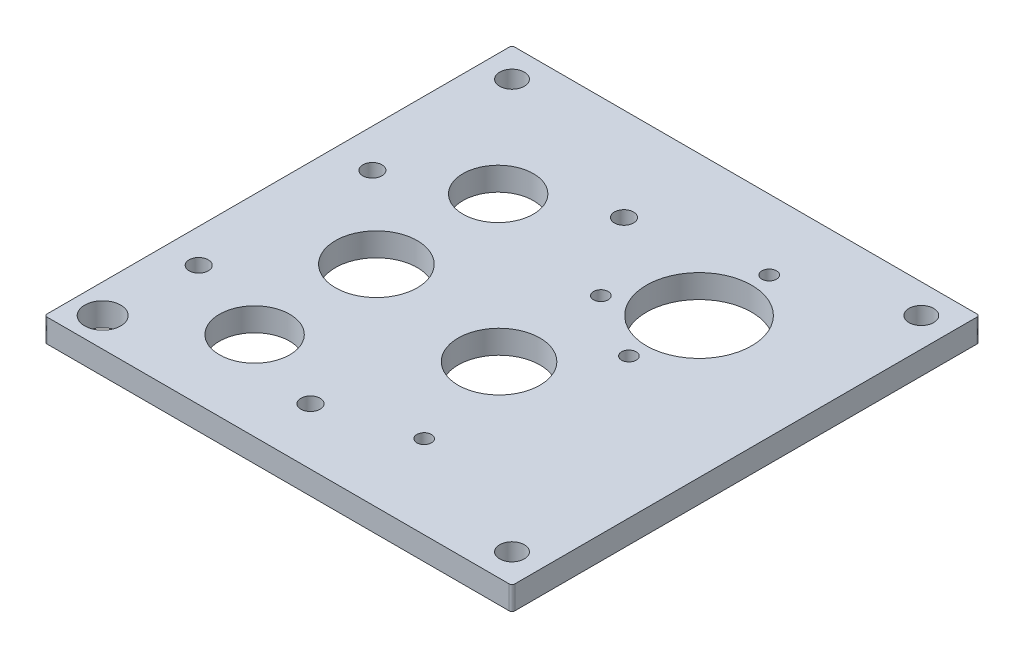
ISO-10303-21;
HEADER;
FILE_DESCRIPTION(('STEP AP214'),'2;1');
FILE_NAME('part.step','',(''),(''),'','','');
FILE_SCHEMA(('AUTOMOTIVE_DESIGN { 1 0 10303 214 1 1 1 1 }'));
ENDSEC;
DATA;
#1=APPLICATION_CONTEXT('core data for automotive mechanical design processes');
#2=APPLICATION_PROTOCOL_DEFINITION('international standard','automotive_design',2000,#1);
#3=PRODUCT_CONTEXT('',#1,'mechanical');
#4=PRODUCT('Part','Part','',(#3));
#5=PRODUCT_RELATED_PRODUCT_CATEGORY('part','',(#4));
#6=PRODUCT_DEFINITION_FORMATION('','',#4);
#7=PRODUCT_DEFINITION_CONTEXT('part definition',#1,'design');
#8=PRODUCT_DEFINITION('design','',#6,#7);
#9=PRODUCT_DEFINITION_SHAPE('','',#8);
#10=(LENGTH_UNIT() NAMED_UNIT(*) SI_UNIT(.MILLI.,.METRE.));
#11=(NAMED_UNIT(*) PLANE_ANGLE_UNIT() SI_UNIT($,.RADIAN.));
#12=(NAMED_UNIT(*) SI_UNIT($,.STERADIAN.) SOLID_ANGLE_UNIT());
#13=UNCERTAINTY_MEASURE_WITH_UNIT(LENGTH_MEASURE(1.E-05),#10,'distance_accuracy_value','');
#14=(GEOMETRIC_REPRESENTATION_CONTEXT(3) GLOBAL_UNCERTAINTY_ASSIGNED_CONTEXT((#13)) GLOBAL_UNIT_ASSIGNED_CONTEXT((#10,
#11,#12)) REPRESENTATION_CONTEXT('',''));
#15=CARTESIAN_POINT('',(0.,0.,0.));
#16=DIRECTION('',(0.,0.,1.));
#17=DIRECTION('',(1.,0.,0.));
#18=AXIS2_PLACEMENT_3D('',#15,#16,#17);
#19=CARTESIAN_POINT('',(126.238,-6.35,126.238));
#20=DIRECTION('',(0.,-1.,0.));
#21=DIRECTION('',(0.,0.,-1.));
#22=AXIS2_PLACEMENT_3D('',#19,#20,#21);
#23=CYLINDRICAL_SURFACE('',#22,0.762);
#24=CARTESIAN_POINT('',(126.238,0.,126.238));
#25=DIRECTION('',(0.,-1.,0.));
#26=DIRECTION('',(0.,0.,-1.));
#27=AXIS2_PLACEMENT_3D('',#24,#25,#26);
#28=CIRCLE('',#27,0.762);
#29=CARTESIAN_POINT('',(126.238,0.,127.));
#30=VERTEX_POINT('',#29);
#31=CARTESIAN_POINT('',(127.,0.,126.238));
#32=VERTEX_POINT('',#31);
#33=EDGE_CURVE('E100',#30,#32,#28,.F.);
#34=ORIENTED_EDGE('',*,*,#33,.F.);
#35=DIRECTION('',(0.,1.,0.));
#36=VECTOR('',#35,1.);
#37=CARTESIAN_POINT('',(126.238,-6.35,127.));
#38=LINE('',#37,#36);
#39=CARTESIAN_POINT('',(126.238,-6.35,127.));
#40=VERTEX_POINT('',#39);
#41=EDGE_CURVE('E126',#40,#30,#38,.T.);
#42=ORIENTED_EDGE('',*,*,#41,.F.);
#43=CARTESIAN_POINT('',(126.238,-6.35,126.238));
#44=DIRECTION('',(0.,-1.,0.));
#45=DIRECTION('',(0.,0.,-1.));
#46=AXIS2_PLACEMENT_3D('',#43,#44,#45);
#47=CIRCLE('',#46,0.762);
#48=CARTESIAN_POINT('',(127.,-6.35,126.238));
#49=VERTEX_POINT('',#48);
#50=EDGE_CURVE('E19',#40,#49,#47,.F.);
#51=ORIENTED_EDGE('',*,*,#50,.T.);
#52=DIRECTION('',(0.,1.,0.));
#53=VECTOR('',#52,1.);
#54=CARTESIAN_POINT('',(127.,-6.35,126.238));
#55=LINE('',#54,#53);
#56=EDGE_CURVE('E110',#32,#49,#55,.F.);
#57=ORIENTED_EDGE('',*,*,#56,.F.);
#58=EDGE_LOOP('',(#34,#42,#51,#57));
#59=FACE_BOUND('',#58,.T.);
#60=ADVANCED_FACE('F16',(#59),#23,.T.);
#61=CARTESIAN_POINT('',(126.238,-6.35,0.762000000000013));
#62=DIRECTION('',(0.,-1.,0.));
#63=DIRECTION('',(0.,0.,-1.));
#64=AXIS2_PLACEMENT_3D('',#61,#62,#63);
#65=CYLINDRICAL_SURFACE('',#64,0.762);
#66=CARTESIAN_POINT('',(126.238,0.,0.762000000000013));
#67=DIRECTION('',(0.,-1.,0.));
#68=DIRECTION('',(0.,0.,-1.));
#69=AXIS2_PLACEMENT_3D('',#66,#67,#68);
#70=CIRCLE('',#69,0.762);
#71=CARTESIAN_POINT('',(127.,0.,0.762000000000013));
#72=VERTEX_POINT('',#71);
#73=CARTESIAN_POINT('',(126.238,0.,0.));
#74=VERTEX_POINT('',#73);
#75=EDGE_CURVE('E88',#72,#74,#70,.F.);
#76=ORIENTED_EDGE('',*,*,#75,.F.);
#77=DIRECTION('',(0.,1.,0.));
#78=VECTOR('',#77,1.);
#79=CARTESIAN_POINT('',(127.,-6.35,0.762000000000013));
#80=LINE('',#79,#78);
#81=CARTESIAN_POINT('',(127.,-6.35,0.762000000000013));
#82=VERTEX_POINT('',#81);
#83=EDGE_CURVE('E91',#82,#72,#80,.T.);
#84=ORIENTED_EDGE('',*,*,#83,.F.);
#85=CARTESIAN_POINT('',(126.238,-6.35,0.762000000000013));
#86=DIRECTION('',(0.,-1.,0.));
#87=DIRECTION('',(0.,0.,-1.));
#88=AXIS2_PLACEMENT_3D('',#85,#86,#87);
#89=CIRCLE('',#88,0.762);
#90=CARTESIAN_POINT('',(126.238,-6.35,0.));
#91=VERTEX_POINT('',#90);
#92=EDGE_CURVE('E234',#82,#91,#89,.F.);
#93=ORIENTED_EDGE('',*,*,#92,.T.);
#94=DIRECTION('',(0.,1.,0.));
#95=VECTOR('',#94,1.);
#96=CARTESIAN_POINT('',(126.238,-6.35,0.));
#97=LINE('',#96,#95);
#98=EDGE_CURVE('E94',#74,#91,#97,.F.);
#99=ORIENTED_EDGE('',*,*,#98,.F.);
#100=EDGE_LOOP('',(#76,#84,#93,#99));
#101=FACE_BOUND('',#100,.T.);
#102=ADVANCED_FACE('F90',(#101),#65,.T.);
#103=CARTESIAN_POINT('',(0.762000000000013,-6.35,0.762000000000007));
#104=DIRECTION('',(0.,-1.,0.));
#105=DIRECTION('',(0.,0.,-1.));
#106=AXIS2_PLACEMENT_3D('',#103,#104,#105);
#107=CYLINDRICAL_SURFACE('',#106,0.762);
#108=CARTESIAN_POINT('',(0.762000000000013,0.,0.762000000000007));
#109=DIRECTION('',(0.,-1.,0.));
#110=DIRECTION('',(0.,0.,-1.));
#111=AXIS2_PLACEMENT_3D('',#108,#109,#110);
#112=CIRCLE('',#111,0.762);
#113=CARTESIAN_POINT('',(0.762000000000013,0.,0.));
#114=VERTEX_POINT('',#113);
#115=CARTESIAN_POINT('',(0.,0.,0.762000000000007));
#116=VERTEX_POINT('',#115);
#117=EDGE_CURVE('E231',#114,#116,#112,.F.);
#118=ORIENTED_EDGE('',*,*,#117,.F.);
#119=DIRECTION('',(0.,1.,0.));
#120=VECTOR('',#119,1.);
#121=CARTESIAN_POINT('',(0.762000000000013,-6.35,0.));
#122=LINE('',#121,#120);
#123=CARTESIAN_POINT('',(0.762000000000013,-6.35,0.));
#124=VERTEX_POINT('',#123);
#125=EDGE_CURVE('E109',#124,#114,#122,.T.);
#126=ORIENTED_EDGE('',*,*,#125,.F.);
#127=CARTESIAN_POINT('',(0.762000000000013,-6.35,0.762000000000007));
#128=DIRECTION('',(0.,-1.,0.));
#129=DIRECTION('',(0.,0.,-1.));
#130=AXIS2_PLACEMENT_3D('',#127,#128,#129);
#131=CIRCLE('',#130,0.762);
#132=CARTESIAN_POINT('',(0.,-6.35,0.762000000000008));
#133=VERTEX_POINT('',#132);
#134=EDGE_CURVE('E34',#124,#133,#131,.F.);
#135=ORIENTED_EDGE('',*,*,#134,.T.);
#136=DIRECTION('',(0.,1.,0.));
#137=VECTOR('',#136,1.);
#138=CARTESIAN_POINT('',(0.,-6.35,0.762000000000007));
#139=LINE('',#138,#137);
#140=EDGE_CURVE('E247',#116,#133,#139,.F.);
#141=ORIENTED_EDGE('',*,*,#140,.F.);
#142=EDGE_LOOP('',(#118,#126,#135,#141));
#143=FACE_BOUND('',#142,.T.);
#144=ADVANCED_FACE('F261',(#143),#107,.T.);
#145=CARTESIAN_POINT('',(0.762,-6.35,126.238));
#146=DIRECTION('',(0.,-1.,0.));
#147=DIRECTION('',(0.,0.,-1.));
#148=AXIS2_PLACEMENT_3D('',#145,#146,#147);
#149=CYLINDRICAL_SURFACE('',#148,0.762);
#150=CARTESIAN_POINT('',(0.762,0.,126.238));
#151=DIRECTION('',(0.,-1.,0.));
#152=DIRECTION('',(0.,0.,-1.));
#153=AXIS2_PLACEMENT_3D('',#150,#151,#152);
#154=CIRCLE('',#153,0.762);
#155=CARTESIAN_POINT('',(0.,0.,126.238));
#156=VERTEX_POINT('',#155);
#157=CARTESIAN_POINT('',(0.762,0.,127.));
#158=VERTEX_POINT('',#157);
#159=EDGE_CURVE('E229',#156,#158,#154,.F.);
#160=ORIENTED_EDGE('',*,*,#159,.F.);
#161=DIRECTION('',(0.,1.,0.));
#162=VECTOR('',#161,1.);
#163=CARTESIAN_POINT('',(0.,-6.35,126.238));
#164=LINE('',#163,#162);
#165=CARTESIAN_POINT('',(0.,-6.35,126.238));
#166=VERTEX_POINT('',#165);
#167=EDGE_CURVE('E204',#166,#156,#164,.T.);
#168=ORIENTED_EDGE('',*,*,#167,.F.);
#169=CARTESIAN_POINT('',(0.762,-6.35,126.238));
#170=DIRECTION('',(0.,-1.,0.));
#171=DIRECTION('',(0.,0.,-1.));
#172=AXIS2_PLACEMENT_3D('',#169,#170,#171);
#173=CIRCLE('',#172,0.762);
#174=CARTESIAN_POINT('',(0.762,-6.35,127.));
#175=VERTEX_POINT('',#174);
#176=EDGE_CURVE('E58',#166,#175,#173,.F.);
#177=ORIENTED_EDGE('',*,*,#176,.T.);
#178=DIRECTION('',(0.,1.,0.));
#179=VECTOR('',#178,1.);
#180=CARTESIAN_POINT('',(0.762,-6.35,127.));
#181=LINE('',#180,#179);
#182=EDGE_CURVE('E116',#158,#175,#181,.F.);
#183=ORIENTED_EDGE('',*,*,#182,.F.);
#184=EDGE_LOOP('',(#160,#168,#177,#183));
#185=FACE_BOUND('',#184,.T.);
#186=ADVANCED_FACE('F264',(#185),#149,.T.);
#187=CARTESIAN_POINT('',(0.,0.,127.));
#188=DIRECTION('',(0.,1.,0.));
#189=DIRECTION('',(0.,0.,1.));
#190=AXIS2_PLACEMENT_3D('',#187,#188,#189);
#191=PLANE('',#190);
#192=CARTESIAN_POINT('',(7.9248,0.,119.0752));
#193=DIRECTION('',(0.,1.,0.));
#194=DIRECTION('',(0.,0.,1.));
#195=AXIS2_PLACEMENT_3D('',#192,#193,#194);
#196=CIRCLE('',#195,4.9022);
#197=CARTESIAN_POINT('',(7.9248,0.,123.9774));
#198=VERTEX_POINT('',#197);
#199=EDGE_CURVE('E177',#198,#198,#196,.F.);
#200=ORIENTED_EDGE('',*,*,#199,.T.);
#201=EDGE_LOOP('',(#200));
#202=FACE_BOUND('',#201,.T.);
#203=CARTESIAN_POINT('',(80.5379445387263,0.,104.383776272295));
#204=DIRECTION('',(0.,-1.,0.));
#205=DIRECTION('',(0.,0.,-1.));
#206=AXIS2_PLACEMENT_3D('',#203,#204,#205);
#207=CIRCLE('',#206,1.98374);
#208=CARTESIAN_POINT('',(80.5379445387263,0.,102.400036272295));
#209=VERTEX_POINT('',#208);
#210=EDGE_CURVE('E180',#209,#209,#207,.T.);
#211=ORIENTED_EDGE('',*,*,#210,.T.);
#212=EDGE_LOOP('',(#211));
#213=FACE_BOUND('',#212,.T.);
#214=CARTESIAN_POINT('',(70.8958634043455,0.,46.7649714304898));
#215=DIRECTION('',(0.,-1.,0.));
#216=DIRECTION('',(0.,0.,-1.));
#217=AXIS2_PLACEMENT_3D('',#214,#215,#216);
#218=CIRCLE('',#217,1.98374);
#219=CARTESIAN_POINT('',(70.8958634043455,0.,44.7812314304898));
#220=VERTEX_POINT('',#219);
#221=EDGE_CURVE('E183',#220,#220,#218,.T.);
#222=ORIENTED_EDGE('',*,*,#221,.T.);
#223=EDGE_LOOP('',(#222));
#224=FACE_BOUND('',#223,.T.);
#225=CARTESIAN_POINT('',(119.0752,0.,119.0752));
#226=DIRECTION('',(0.,1.,0.));
#227=DIRECTION('',(0.,0.,1.));
#228=AXIS2_PLACEMENT_3D('',#225,#226,#227);
#229=CIRCLE('',#228,3.3528);
#230=CARTESIAN_POINT('',(119.0752,0.,122.428));
#231=VERTEX_POINT('',#230);
#232=EDGE_CURVE('E186',#231,#231,#229,.F.);
#233=ORIENTED_EDGE('',*,*,#232,.T.);
#234=EDGE_LOOP('',(#233));
#235=FACE_BOUND('',#234,.T.);
#236=CARTESIAN_POINT('',(7.92480000000001,0.,7.92480000000001));
#237=DIRECTION('',(0.,1.,0.));
#238=DIRECTION('',(0.,0.,1.));
#239=AXIS2_PLACEMENT_3D('',#236,#237,#238);
#240=CIRCLE('',#239,3.3528);
#241=CARTESIAN_POINT('',(7.92480000000001,0.,11.2776));
#242=VERTEX_POINT('',#241);
#243=EDGE_CURVE('E189',#242,#242,#240,.F.);
#244=ORIENTED_EDGE('',*,*,#243,.T.);
#245=EDGE_LOOP('',(#244));
#246=FACE_BOUND('',#245,.T.);
#247=CARTESIAN_POINT('',(72.5854471866552,0.,76.0984));
#248=DIRECTION('',(0.,1.,0.));
#249=DIRECTION('',(0.,0.,1.));
#250=AXIS2_PLACEMENT_3D('',#247,#248,#249);
#251=CIRCLE('',#250,11.10615);
#252=CARTESIAN_POINT('',(72.5854471866552,0.,87.20455));
#253=VERTEX_POINT('',#252);
#254=EDGE_CURVE('E192',#253,#253,#251,.F.);
#255=ORIENTED_EDGE('',*,*,#254,.T.);
#256=EDGE_LOOP('',(#255));
#257=FACE_BOUND('',#256,.T.);
#258=CARTESIAN_POINT('',(56.8881925679621,0.,111.608111640472));
#259=DIRECTION('',(0.,1.,0.));
#260=DIRECTION('',(0.,0.,1.));
#261=AXIS2_PLACEMENT_3D('',#258,#259,#260);
#262=CIRCLE('',#261,2.6035);
#263=CARTESIAN_POINT('',(56.8881925679621,0.,114.211611640472));
#264=VERTEX_POINT('',#263);
#265=EDGE_CURVE('E195',#264,#264,#262,.F.);
#266=ORIENTED_EDGE('',*,*,#265,.T.);
#267=EDGE_LOOP('',(#266));
#268=FACE_BOUND('',#267,.T.);
#269=CARTESIAN_POINT('',(33.02,0.,102.9208));
#270=DIRECTION('',(0.,1.,0.));
#271=DIRECTION('',(0.,0.,1.));
#272=AXIS2_PLACEMENT_3D('',#269,#270,#271);
#273=CIRCLE('',#272,9.5504);
#274=CARTESIAN_POINT('',(33.02,0.,112.4712));
#275=VERTEX_POINT('',#274);
#276=EDGE_CURVE('E198',#275,#275,#273,.F.);
#277=ORIENTED_EDGE('',*,*,#276,.T.);
#278=EDGE_LOOP('',(#277));
#279=FACE_BOUND('',#278,.T.);
#280=CARTESIAN_POINT('',(10.3884342856154,0.,48.3105586933845));
#281=DIRECTION('',(0.,1.,0.));
#282=DIRECTION('',(0.,0.,1.));
#283=AXIS2_PLACEMENT_3D('',#280,#281,#282);
#284=CIRCLE('',#283,2.6035);
#285=CARTESIAN_POINT('',(10.3884342856154,0.,50.9140586933845));
#286=VERTEX_POINT('',#285);
#287=EDGE_CURVE('E201',#286,#286,#284,.F.);
#288=ORIENTED_EDGE('',*,*,#287,.T.);
#289=EDGE_LOOP('',(#288));
#290=FACE_BOUND('',#289,.T.);
#291=DIRECTION('',(0.,0.,-1.));
#292=VECTOR('',#291,1.);
#293=CARTESIAN_POINT('',(127.,0.,127.));
#294=LINE('',#293,#292);
#295=EDGE_CURVE('E106',#72,#32,#294,.F.);
#296=ORIENTED_EDGE('',*,*,#295,.F.);
#297=ORIENTED_EDGE('',*,*,#75,.T.);
#298=DIRECTION('',(-1.,0.,0.));
#299=VECTOR('',#298,1.);
#300=CARTESIAN_POINT('',(127.,0.,0.));
#301=LINE('',#300,#299);
#302=EDGE_CURVE('E123',#114,#74,#301,.F.);
#303=ORIENTED_EDGE('',*,*,#302,.F.);
#304=ORIENTED_EDGE('',*,*,#117,.T.);
#305=DIRECTION('',(0.,0.,1.));
#306=VECTOR('',#305,1.);
#307=CARTESIAN_POINT('',(0.,0.,0.));
#308=LINE('',#307,#306);
#309=EDGE_CURVE('E249',#156,#116,#308,.F.);
#310=ORIENTED_EDGE('',*,*,#309,.F.);
#311=ORIENTED_EDGE('',*,*,#159,.T.);
#312=DIRECTION('',(1.,0.,0.));
#313=VECTOR('',#312,1.);
#314=CARTESIAN_POINT('',(0.,0.,127.));
#315=LINE('',#314,#313);
#316=EDGE_CURVE('E119',#30,#158,#315,.F.);
#317=ORIENTED_EDGE('',*,*,#316,.F.);
#318=ORIENTED_EDGE('',*,*,#33,.T.);
#319=EDGE_LOOP('',(#296,#297,#303,#304,#310,#311,#317,#318));
#320=FACE_BOUND('',#319,.T.);
#321=CARTESIAN_POINT('',(33.02,0.,69.85));
#322=DIRECTION('',(0.,1.,0.));
#323=DIRECTION('',(0.,0.,1.));
#324=AXIS2_PLACEMENT_3D('',#321,#322,#323);
#325=CIRCLE('',#324,11.10615);
#326=CARTESIAN_POINT('',(33.02,0.,80.95615));
#327=VERTEX_POINT('',#326);
#328=EDGE_CURVE('E205',#327,#327,#325,.F.);
#329=ORIENTED_EDGE('',*,*,#328,.T.);
#330=EDGE_LOOP('',(#329));
#331=FACE_BOUND('',#330,.T.);
#332=CARTESIAN_POINT('',(55.6515657143845,0.,25.2478413066155));
#333=DIRECTION('',(0.,1.,0.));
#334=DIRECTION('',(0.,0.,1.));
#335=AXIS2_PLACEMENT_3D('',#332,#333,#334);
#336=CIRCLE('',#335,2.6035);
#337=CARTESIAN_POINT('',(55.6515657143845,0.,27.8513413066155));
#338=VERTEX_POINT('',#337);
#339=EDGE_CURVE('E208',#338,#338,#336,.F.);
#340=ORIENTED_EDGE('',*,*,#339,.T.);
#341=EDGE_LOOP('',(#340));
#342=FACE_BOUND('',#341,.T.);
#343=CARTESIAN_POINT('',(9.15180743203793,0.,94.233488359528));
#344=DIRECTION('',(0.,1.,0.));
#345=DIRECTION('',(0.,0.,1.));
#346=AXIS2_PLACEMENT_3D('',#343,#344,#345);
#347=CIRCLE('',#346,2.6035);
#348=CARTESIAN_POINT('',(9.15180743203793,0.,96.836988359528));
#349=VERTEX_POINT('',#348);
#350=EDGE_CURVE('E211',#349,#349,#347,.F.);
#351=ORIENTED_EDGE('',*,*,#350,.T.);
#352=EDGE_LOOP('',(#351));
#353=FACE_BOUND('',#352,.T.);
#354=CARTESIAN_POINT('',(33.02,0.,36.7792));
#355=DIRECTION('',(0.,1.,0.));
#356=DIRECTION('',(0.,0.,1.));
#357=AXIS2_PLACEMENT_3D('',#354,#355,#356);
#358=CIRCLE('',#357,9.5504);
#359=CARTESIAN_POINT('',(33.02,0.,46.3296));
#360=VERTEX_POINT('',#359);
#361=EDGE_CURVE('E214',#360,#360,#358,.F.);
#362=ORIENTED_EDGE('',*,*,#361,.T.);
#363=EDGE_LOOP('',(#362));
#364=FACE_BOUND('',#363,.T.);
#365=CARTESIAN_POINT('',(88.8962822014544,0.,38.1));
#366=DIRECTION('',(0.,1.,0.));
#367=DIRECTION('',(0.,0.,1.));
#368=AXIS2_PLACEMENT_3D('',#365,#366,#367);
#369=CIRCLE('',#368,14.28115);
#370=CARTESIAN_POINT('',(88.8962822014544,0.,52.38115));
#371=VERTEX_POINT('',#370);
#372=EDGE_CURVE('E217',#371,#371,#369,.F.);
#373=ORIENTED_EDGE('',*,*,#372,.T.);
#374=EDGE_LOOP('',(#373));
#375=FACE_BOUND('',#374,.T.);
#376=CARTESIAN_POINT('',(119.0752,0.,7.92480000000001));
#377=DIRECTION('',(0.,1.,0.));
#378=DIRECTION('',(0.,0.,1.));
#379=AXIS2_PLACEMENT_3D('',#376,#377,#378);
#380=CIRCLE('',#379,3.3528);
#381=CARTESIAN_POINT('',(119.0752,0.,11.2776));
#382=VERTEX_POINT('',#381);
#383=EDGE_CURVE('E220',#382,#382,#380,.F.);
#384=ORIENTED_EDGE('',*,*,#383,.T.);
#385=EDGE_LOOP('',(#384));
#386=FACE_BOUND('',#385,.T.);
#387=CARTESIAN_POINT('',(88.8962822014544,0.,57.15));
#388=DIRECTION('',(0.,-1.,0.));
#389=DIRECTION('',(0.,0.,-1.));
#390=AXIS2_PLACEMENT_3D('',#387,#388,#389);
#391=CIRCLE('',#390,1.98374);
#392=CARTESIAN_POINT('',(88.8962822014544,0.,55.16626));
#393=VERTEX_POINT('',#392);
#394=EDGE_CURVE('E223',#393,#393,#391,.T.);
#395=ORIENTED_EDGE('',*,*,#394,.T.);
#396=EDGE_LOOP('',(#395));
#397=FACE_BOUND('',#396,.T.);
#398=CARTESIAN_POINT('',(88.8962822014544,0.,19.05));
#399=DIRECTION('',(0.,-1.,0.));
#400=DIRECTION('',(0.,0.,-1.));
#401=AXIS2_PLACEMENT_3D('',#398,#399,#400);
#402=CIRCLE('',#401,1.98374);
#403=CARTESIAN_POINT('',(88.8962822014544,0.,17.06626));
#404=VERTEX_POINT('',#403);
#405=EDGE_CURVE('E99',#404,#404,#402,.T.);
#406=ORIENTED_EDGE('',*,*,#405,.T.);
#407=EDGE_LOOP('',(#406));
#408=FACE_BOUND('',#407,.T.);
#409=ADVANCED_FACE('F112',(#202,#213,#224,#235,#246,#257,#268,#279,#290,#320,#331,#342,#353,
#364,#375,#386,#397,#408),#191,.T.);
#410=CARTESIAN_POINT('',(88.8962822014544,-6.35,19.05));
#411=DIRECTION('',(0.,-1.,0.));
#412=DIRECTION('',(0.,0.,-1.));
#413=AXIS2_PLACEMENT_3D('',#410,#411,#412);
#414=CYLINDRICAL_SURFACE('',#413,1.98374);
#415=CARTESIAN_POINT('',(88.8962822014544,-6.35,19.05));
#416=DIRECTION('',(0.,-1.,0.));
#417=DIRECTION('',(0.,0.,-1.));
#418=AXIS2_PLACEMENT_3D('',#415,#416,#417);
#419=CIRCLE('',#418,1.98374);
#420=CARTESIAN_POINT('',(88.8962822014544,-6.35,17.06626));
#421=VERTEX_POINT('',#420);
#422=EDGE_CURVE('E174',#421,#421,#419,.T.);
#423=ORIENTED_EDGE('',*,*,#422,.T.);
#424=EDGE_LOOP('',(#423));
#425=FACE_BOUND('',#424,.T.);
#426=ORIENTED_EDGE('',*,*,#405,.F.);
#427=EDGE_LOOP('',(#426));
#428=FACE_BOUND('',#427,.T.);
#429=ADVANCED_FACE('F432',(#425,#428),#414,.F.);
#430=CARTESIAN_POINT('',(88.8962822014544,-6.35,57.15));
#431=DIRECTION('',(0.,-1.,0.));
#432=DIRECTION('',(0.,0.,-1.));
#433=AXIS2_PLACEMENT_3D('',#430,#431,#432);
#434=CYLINDRICAL_SURFACE('',#433,1.98374);
#435=CARTESIAN_POINT('',(88.8962822014544,-6.35,57.15));
#436=DIRECTION('',(0.,-1.,0.));
#437=DIRECTION('',(0.,0.,-1.));
#438=AXIS2_PLACEMENT_3D('',#435,#436,#437);
#439=CIRCLE('',#438,1.98374);
#440=CARTESIAN_POINT('',(88.8962822014544,-6.35,55.16626));
#441=VERTEX_POINT('',#440);
#442=EDGE_CURVE('E171',#441,#441,#439,.T.);
#443=ORIENTED_EDGE('',*,*,#442,.T.);
#444=EDGE_LOOP('',(#443));
#445=FACE_BOUND('',#444,.T.);
#446=ORIENTED_EDGE('',*,*,#394,.F.);
#447=EDGE_LOOP('',(#446));
#448=FACE_BOUND('',#447,.T.);
#449=ADVANCED_FACE('F424',(#445,#448),#434,.F.);
#450=CARTESIAN_POINT('',(119.0752,173.367340565678,7.92480000000001));
#451=DIRECTION('',(0.,1.,0.));
#452=DIRECTION('',(0.,0.,1.));
#453=AXIS2_PLACEMENT_3D('',#450,#451,#452);
#454=CYLINDRICAL_SURFACE('',#453,3.3528);
#455=ORIENTED_EDGE('',*,*,#383,.F.);
#456=EDGE_LOOP('',(#455));
#457=FACE_BOUND('',#456,.T.);
#458=CARTESIAN_POINT('',(119.0752,-6.34999999999999,7.92480000000001));
#459=DIRECTION('',(0.,1.,0.));
#460=DIRECTION('',(0.,0.,1.));
#461=AXIS2_PLACEMENT_3D('',#458,#459,#460);
#462=CIRCLE('',#461,3.3528);
#463=CARTESIAN_POINT('',(119.0752,-6.34999999999999,11.2776));
#464=VERTEX_POINT('',#463);
#465=EDGE_CURVE('E168',#464,#464,#462,.F.);
#466=ORIENTED_EDGE('',*,*,#465,.T.);
#467=EDGE_LOOP('',(#466));
#468=FACE_BOUND('',#467,.T.);
#469=ADVANCED_FACE('F416',(#457,#468),#454,.F.);
#470=CARTESIAN_POINT('',(88.8962822014544,173.367340565678,38.1));
#471=DIRECTION('',(0.,1.,0.));
#472=DIRECTION('',(0.,0.,1.));
#473=AXIS2_PLACEMENT_3D('',#470,#471,#472);
#474=CYLINDRICAL_SURFACE('',#473,14.28115);
#475=ORIENTED_EDGE('',*,*,#372,.F.);
#476=EDGE_LOOP('',(#475));
#477=FACE_BOUND('',#476,.T.);
#478=CARTESIAN_POINT('',(88.8962822014544,-6.34999999999999,38.1));
#479=DIRECTION('',(0.,1.,0.));
#480=DIRECTION('',(0.,0.,1.));
#481=AXIS2_PLACEMENT_3D('',#478,#479,#480);
#482=CIRCLE('',#481,14.28115);
#483=CARTESIAN_POINT('',(88.8962822014544,-6.34999999999999,52.38115));
#484=VERTEX_POINT('',#483);
#485=EDGE_CURVE('E165',#484,#484,#482,.F.);
#486=ORIENTED_EDGE('',*,*,#485,.T.);
#487=EDGE_LOOP('',(#486));
#488=FACE_BOUND('',#487,.T.);
#489=ADVANCED_FACE('F408',(#477,#488),#474,.F.);
#490=CARTESIAN_POINT('',(33.02,173.367340565678,36.7792));
#491=DIRECTION('',(0.,1.,0.));
#492=DIRECTION('',(0.,0.,1.));
#493=AXIS2_PLACEMENT_3D('',#490,#491,#492);
#494=CYLINDRICAL_SURFACE('',#493,9.5504);
#495=ORIENTED_EDGE('',*,*,#361,.F.);
#496=EDGE_LOOP('',(#495));
#497=FACE_BOUND('',#496,.T.);
#498=CARTESIAN_POINT('',(33.02,-6.34999999999999,36.7792));
#499=DIRECTION('',(0.,1.,0.));
#500=DIRECTION('',(0.,0.,1.));
#501=AXIS2_PLACEMENT_3D('',#498,#499,#500);
#502=CIRCLE('',#501,9.5504);
#503=CARTESIAN_POINT('',(33.02,-6.34999999999999,46.3296));
#504=VERTEX_POINT('',#503);
#505=EDGE_CURVE('E162',#504,#504,#502,.F.);
#506=ORIENTED_EDGE('',*,*,#505,.T.);
#507=EDGE_LOOP('',(#506));
#508=FACE_BOUND('',#507,.T.);
#509=ADVANCED_FACE('F400',(#497,#508),#494,.F.);
#510=CARTESIAN_POINT('',(9.15180743203793,173.367340565678,94.233488359528));
#511=DIRECTION('',(0.,1.,0.));
#512=DIRECTION('',(0.,0.,1.));
#513=AXIS2_PLACEMENT_3D('',#510,#511,#512);
#514=CYLINDRICAL_SURFACE('',#513,2.6035);
#515=ORIENTED_EDGE('',*,*,#350,.F.);
#516=EDGE_LOOP('',(#515));
#517=FACE_BOUND('',#516,.T.);
#518=CARTESIAN_POINT('',(9.15180743203793,-6.34999999999999,94.233488359528));
#519=DIRECTION('',(0.,1.,0.));
#520=DIRECTION('',(0.,0.,1.));
#521=AXIS2_PLACEMENT_3D('',#518,#519,#520);
#522=CIRCLE('',#521,2.6035);
#523=CARTESIAN_POINT('',(9.15180743203793,-6.34999999999999,96.836988359528));
#524=VERTEX_POINT('',#523);
#525=EDGE_CURVE('E159',#524,#524,#522,.F.);
#526=ORIENTED_EDGE('',*,*,#525,.T.);
#527=EDGE_LOOP('',(#526));
#528=FACE_BOUND('',#527,.T.);
#529=ADVANCED_FACE('F392',(#517,#528),#514,.F.);
#530=CARTESIAN_POINT('',(55.6515657143845,173.367340565678,25.2478413066155));
#531=DIRECTION('',(0.,1.,0.));
#532=DIRECTION('',(0.,0.,1.));
#533=AXIS2_PLACEMENT_3D('',#530,#531,#532);
#534=CYLINDRICAL_SURFACE('',#533,2.6035);
#535=ORIENTED_EDGE('',*,*,#339,.F.);
#536=EDGE_LOOP('',(#535));
#537=FACE_BOUND('',#536,.T.);
#538=CARTESIAN_POINT('',(55.6515657143845,-6.34999999999999,25.2478413066155));
#539=DIRECTION('',(0.,1.,0.));
#540=DIRECTION('',(0.,0.,1.));
#541=AXIS2_PLACEMENT_3D('',#538,#539,#540);
#542=CIRCLE('',#541,2.6035);
#543=CARTESIAN_POINT('',(55.6515657143845,-6.34999999999999,27.8513413066155));
#544=VERTEX_POINT('',#543);
#545=EDGE_CURVE('E156',#544,#544,#542,.F.);
#546=ORIENTED_EDGE('',*,*,#545,.T.);
#547=EDGE_LOOP('',(#546));
#548=FACE_BOUND('',#547,.T.);
#549=ADVANCED_FACE('F276',(#537,#548),#534,.F.);
#550=CARTESIAN_POINT('',(33.02,173.367340565678,69.85));
#551=DIRECTION('',(0.,1.,0.));
#552=DIRECTION('',(0.,0.,1.));
#553=AXIS2_PLACEMENT_3D('',#550,#551,#552);
#554=CYLINDRICAL_SURFACE('',#553,11.10615);
#555=ORIENTED_EDGE('',*,*,#328,.F.);
#556=EDGE_LOOP('',(#555));
#557=FACE_BOUND('',#556,.T.);
#558=CARTESIAN_POINT('',(33.02,-6.34999999999999,69.85));
#559=DIRECTION('',(0.,1.,0.));
#560=DIRECTION('',(0.,0.,1.));
#561=AXIS2_PLACEMENT_3D('',#558,#559,#560);
#562=CIRCLE('',#561,11.10615);
#563=CARTESIAN_POINT('',(33.02,-6.34999999999999,80.95615));
#564=VERTEX_POINT('',#563);
#565=EDGE_CURVE('E152',#564,#564,#562,.F.);
#566=ORIENTED_EDGE('',*,*,#565,.T.);
#567=EDGE_LOOP('',(#566));
#568=FACE_BOUND('',#567,.T.);
#569=ADVANCED_FACE('F268',(#557,#568),#554,.F.);
#570=CARTESIAN_POINT('',(0.,-6.35,127.));
#571=DIRECTION('',(0.,0.,1.));
#572=DIRECTION('',(1.,0.,0.));
#573=AXIS2_PLACEMENT_3D('',#570,#571,#572);
#574=PLANE('',#573);
#575=ORIENTED_EDGE('',*,*,#316,.T.);
#576=ORIENTED_EDGE('',*,*,#182,.T.);
#577=DIRECTION('',(1.,0.,0.));
#578=VECTOR('',#577,1.);
#579=CARTESIAN_POINT('',(0.,-6.35,127.));
#580=LINE('',#579,#578);
#581=EDGE_CURVE('E155',#175,#40,#580,.T.);
#582=ORIENTED_EDGE('',*,*,#581,.T.);
#583=ORIENTED_EDGE('',*,*,#41,.T.);
#584=EDGE_LOOP('',(#575,#576,#582,#583));
#585=FACE_BOUND('',#584,.T.);
#586=ADVANCED_FACE('F266',(#585),#574,.T.);
#587=CARTESIAN_POINT('',(127.,-6.35,127.));
#588=DIRECTION('',(1.,0.,0.));
#589=DIRECTION('',(0.,0.,-1.));
#590=AXIS2_PLACEMENT_3D('',#587,#588,#589);
#591=PLANE('',#590);
#592=DIRECTION('',(0.,0.,1.));
#593=VECTOR('',#592,1.);
#594=CARTESIAN_POINT('',(127.,-6.35,127.));
#595=LINE('',#594,#593);
#596=EDGE_CURVE('E108',#49,#82,#595,.F.);
#597=ORIENTED_EDGE('',*,*,#596,.T.);
#598=ORIENTED_EDGE('',*,*,#83,.T.);
#599=ORIENTED_EDGE('',*,*,#295,.T.);
#600=ORIENTED_EDGE('',*,*,#56,.T.);
#601=EDGE_LOOP('',(#597,#598,#599,#600));
#602=FACE_BOUND('',#601,.T.);
#603=ADVANCED_FACE('F104',(#602),#591,.T.);
#604=CARTESIAN_POINT('',(127.,-6.35,0.));
#605=DIRECTION('',(0.,0.,-1.));
#606=DIRECTION('',(-1.,0.,0.));
#607=AXIS2_PLACEMENT_3D('',#604,#605,#606);
#608=PLANE('',#607);
#609=ORIENTED_EDGE('',*,*,#302,.T.);
#610=ORIENTED_EDGE('',*,*,#98,.T.);
#611=DIRECTION('',(1.,0.,0.));
#612=VECTOR('',#611,1.);
#613=CARTESIAN_POINT('',(0.,-6.35,0.));
#614=LINE('',#613,#612);
#615=EDGE_CURVE('E240',#91,#124,#614,.F.);
#616=ORIENTED_EDGE('',*,*,#615,.T.);
#617=ORIENTED_EDGE('',*,*,#125,.T.);
#618=EDGE_LOOP('',(#609,#610,#616,#617));
#619=FACE_BOUND('',#618,.T.);
#620=ADVANCED_FACE('F263',(#619),#608,.T.);
#621=CARTESIAN_POINT('',(0.,-6.35,0.));
#622=DIRECTION('',(-1.,0.,0.));
#623=DIRECTION('',(0.,0.,1.));
#624=AXIS2_PLACEMENT_3D('',#621,#622,#623);
#625=PLANE('',#624);
#626=DIRECTION('',(0.,0.,1.));
#627=VECTOR('',#626,1.);
#628=CARTESIAN_POINT('',(0.,-6.35,127.));
#629=LINE('',#628,#627);
#630=EDGE_CURVE('E151',#133,#166,#629,.T.);
#631=ORIENTED_EDGE('',*,*,#630,.T.);
#632=ORIENTED_EDGE('',*,*,#167,.T.);
#633=ORIENTED_EDGE('',*,*,#309,.T.);
#634=ORIENTED_EDGE('',*,*,#140,.T.);
#635=EDGE_LOOP('',(#631,#632,#633,#634));
#636=FACE_BOUND('',#635,.T.);
#637=ADVANCED_FACE('F258',(#636),#625,.T.);
#638=CARTESIAN_POINT('',(10.3884342856154,173.367340565678,48.3105586933845));
#639=DIRECTION('',(0.,1.,0.));
#640=DIRECTION('',(0.,0.,1.));
#641=AXIS2_PLACEMENT_3D('',#638,#639,#640);
#642=CYLINDRICAL_SURFACE('',#641,2.6035);
#643=ORIENTED_EDGE('',*,*,#287,.F.);
#644=EDGE_LOOP('',(#643));
#645=FACE_BOUND('',#644,.T.);
#646=CARTESIAN_POINT('',(10.3884342856154,-6.34999999999999,48.3105586933845));
#647=DIRECTION('',(0.,1.,0.));
#648=DIRECTION('',(0.,0.,1.));
#649=AXIS2_PLACEMENT_3D('',#646,#647,#648);
#650=CIRCLE('',#649,2.6035);
#651=CARTESIAN_POINT('',(10.3884342856154,-6.34999999999999,50.9140586933845));
#652=VERTEX_POINT('',#651);
#653=EDGE_CURVE('E148',#652,#652,#650,.F.);
#654=ORIENTED_EDGE('',*,*,#653,.T.);
#655=EDGE_LOOP('',(#654));
#656=FACE_BOUND('',#655,.T.);
#657=ADVANCED_FACE('F318',(#645,#656),#642,.F.);
#658=CARTESIAN_POINT('',(33.02,173.367340565678,102.9208));
#659=DIRECTION('',(0.,1.,0.));
#660=DIRECTION('',(0.,0.,1.));
#661=AXIS2_PLACEMENT_3D('',#658,#659,#660);
#662=CYLINDRICAL_SURFACE('',#661,9.5504);
#663=ORIENTED_EDGE('',*,*,#276,.F.);
#664=EDGE_LOOP('',(#663));
#665=FACE_BOUND('',#664,.T.);
#666=CARTESIAN_POINT('',(33.02,-6.34999999999999,102.9208));
#667=DIRECTION('',(0.,1.,0.));
#668=DIRECTION('',(0.,0.,1.));
#669=AXIS2_PLACEMENT_3D('',#666,#667,#668);
#670=CIRCLE('',#669,9.5504);
#671=CARTESIAN_POINT('',(33.02,-6.34999999999999,112.4712));
#672=VERTEX_POINT('',#671);
#673=EDGE_CURVE('E145',#672,#672,#670,.F.);
#674=ORIENTED_EDGE('',*,*,#673,.T.);
#675=EDGE_LOOP('',(#674));
#676=FACE_BOUND('',#675,.T.);
#677=ADVANCED_FACE('F314',(#665,#676),#662,.F.);
#678=CARTESIAN_POINT('',(56.8881925679621,173.367340565678,111.608111640472));
#679=DIRECTION('',(0.,1.,0.));
#680=DIRECTION('',(0.,0.,1.));
#681=AXIS2_PLACEMENT_3D('',#678,#679,#680);
#682=CYLINDRICAL_SURFACE('',#681,2.6035);
#683=ORIENTED_EDGE('',*,*,#265,.F.);
#684=EDGE_LOOP('',(#683));
#685=FACE_BOUND('',#684,.T.);
#686=CARTESIAN_POINT('',(56.8881925679621,-6.34999999999999,111.608111640472));
#687=DIRECTION('',(0.,1.,0.));
#688=DIRECTION('',(0.,0.,1.));
#689=AXIS2_PLACEMENT_3D('',#686,#687,#688);
#690=CIRCLE('',#689,2.6035);
#691=CARTESIAN_POINT('',(56.8881925679621,-6.34999999999999,114.211611640472));
#692=VERTEX_POINT('',#691);
#693=EDGE_CURVE('E142',#692,#692,#690,.F.);
#694=ORIENTED_EDGE('',*,*,#693,.T.);
#695=EDGE_LOOP('',(#694));
#696=FACE_BOUND('',#695,.T.);
#697=ADVANCED_FACE('F310',(#685,#696),#682,.F.);
#698=CARTESIAN_POINT('',(72.5854471866552,173.367340565678,76.0984));
#699=DIRECTION('',(0.,1.,0.));
#700=DIRECTION('',(0.,0.,1.));
#701=AXIS2_PLACEMENT_3D('',#698,#699,#700);
#702=CYLINDRICAL_SURFACE('',#701,11.10615);
#703=ORIENTED_EDGE('',*,*,#254,.F.);
#704=EDGE_LOOP('',(#703));
#705=FACE_BOUND('',#704,.T.);
#706=CARTESIAN_POINT('',(72.5854471866552,-6.34999999999999,76.0984));
#707=DIRECTION('',(0.,1.,0.));
#708=DIRECTION('',(0.,0.,1.));
#709=AXIS2_PLACEMENT_3D('',#706,#707,#708);
#710=CIRCLE('',#709,11.10615);
#711=CARTESIAN_POINT('',(72.5854471866552,-6.34999999999999,87.20455));
#712=VERTEX_POINT('',#711);
#713=EDGE_CURVE('E139',#712,#712,#710,.F.);
#714=ORIENTED_EDGE('',*,*,#713,.T.);
#715=EDGE_LOOP('',(#714));
#716=FACE_BOUND('',#715,.T.);
#717=ADVANCED_FACE('F306',(#705,#716),#702,.F.);
#718=CARTESIAN_POINT('',(7.92480000000001,173.367340565678,7.92480000000001));
#719=DIRECTION('',(0.,1.,0.));
#720=DIRECTION('',(0.,0.,1.));
#721=AXIS2_PLACEMENT_3D('',#718,#719,#720);
#722=CYLINDRICAL_SURFACE('',#721,3.3528);
#723=ORIENTED_EDGE('',*,*,#243,.F.);
#724=EDGE_LOOP('',(#723));
#725=FACE_BOUND('',#724,.T.);
#726=CARTESIAN_POINT('',(7.92480000000001,-6.34999999999999,7.92480000000001));
#727=DIRECTION('',(0.,1.,0.));
#728=DIRECTION('',(0.,0.,1.));
#729=AXIS2_PLACEMENT_3D('',#726,#727,#728);
#730=CIRCLE('',#729,3.3528);
#731=CARTESIAN_POINT('',(7.92480000000001,-6.34999999999999,11.2776));
#732=VERTEX_POINT('',#731);
#733=EDGE_CURVE('E136',#732,#732,#730,.F.);
#734=ORIENTED_EDGE('',*,*,#733,.T.);
#735=EDGE_LOOP('',(#734));
#736=FACE_BOUND('',#735,.T.);
#737=ADVANCED_FACE('F302',(#725,#736),#722,.F.);
#738=CARTESIAN_POINT('',(119.0752,173.367340565678,119.0752));
#739=DIRECTION('',(0.,1.,0.));
#740=DIRECTION('',(0.,0.,1.));
#741=AXIS2_PLACEMENT_3D('',#738,#739,#740);
#742=CYLINDRICAL_SURFACE('',#741,3.3528);
#743=ORIENTED_EDGE('',*,*,#232,.F.);
#744=EDGE_LOOP('',(#743));
#745=FACE_BOUND('',#744,.T.);
#746=CARTESIAN_POINT('',(119.0752,-6.34999999999999,119.0752));
#747=DIRECTION('',(0.,1.,0.));
#748=DIRECTION('',(0.,0.,1.));
#749=AXIS2_PLACEMENT_3D('',#746,#747,#748);
#750=CIRCLE('',#749,3.3528);
#751=CARTESIAN_POINT('',(119.0752,-6.34999999999999,122.428));
#752=VERTEX_POINT('',#751);
#753=EDGE_CURVE('E133',#752,#752,#750,.F.);
#754=ORIENTED_EDGE('',*,*,#753,.T.);
#755=EDGE_LOOP('',(#754));
#756=FACE_BOUND('',#755,.T.);
#757=ADVANCED_FACE('F298',(#745,#756),#742,.F.);
#758=CARTESIAN_POINT('',(70.8958634043455,-6.35,46.7649714304898));
#759=DIRECTION('',(0.,-1.,0.));
#760=DIRECTION('',(0.,0.,-1.));
#761=AXIS2_PLACEMENT_3D('',#758,#759,#760);
#762=CYLINDRICAL_SURFACE('',#761,1.98374);
#763=CARTESIAN_POINT('',(70.8958634043455,-6.35,46.7649714304898));
#764=DIRECTION('',(0.,-1.,0.));
#765=DIRECTION('',(0.,0.,-1.));
#766=AXIS2_PLACEMENT_3D('',#763,#764,#765);
#767=CIRCLE('',#766,1.98374);
#768=CARTESIAN_POINT('',(70.8958634043455,-6.35,44.7812314304898));
#769=VERTEX_POINT('',#768);
#770=EDGE_CURVE('E130',#769,#769,#767,.T.);
#771=ORIENTED_EDGE('',*,*,#770,.T.);
#772=EDGE_LOOP('',(#771));
#773=FACE_BOUND('',#772,.T.);
#774=ORIENTED_EDGE('',*,*,#221,.F.);
#775=EDGE_LOOP('',(#774));
#776=FACE_BOUND('',#775,.T.);
#777=ADVANCED_FACE('F294',(#773,#776),#762,.F.);
#778=CARTESIAN_POINT('',(80.5379445387263,-6.35,104.383776272295));
#779=DIRECTION('',(0.,-1.,0.));
#780=DIRECTION('',(0.,0.,-1.));
#781=AXIS2_PLACEMENT_3D('',#778,#779,#780);
#782=CYLINDRICAL_SURFACE('',#781,1.98374);
#783=CARTESIAN_POINT('',(80.5379445387263,-6.35,104.383776272295));
#784=DIRECTION('',(0.,-1.,0.));
#785=DIRECTION('',(0.,0.,-1.));
#786=AXIS2_PLACEMENT_3D('',#783,#784,#785);
#787=CIRCLE('',#786,1.98374);
#788=CARTESIAN_POINT('',(80.5379445387263,-6.35,102.400036272295));
#789=VERTEX_POINT('',#788);
#790=EDGE_CURVE('E25',#789,#789,#787,.T.);
#791=ORIENTED_EDGE('',*,*,#790,.T.);
#792=EDGE_LOOP('',(#791));
#793=FACE_BOUND('',#792,.T.);
#794=ORIENTED_EDGE('',*,*,#210,.F.);
#795=EDGE_LOOP('',(#794));
#796=FACE_BOUND('',#795,.T.);
#797=ADVANCED_FACE('F286',(#793,#796),#782,.F.);
#798=CARTESIAN_POINT('',(7.9248,173.367340565678,119.0752));
#799=DIRECTION('',(0.,1.,0.));
#800=DIRECTION('',(0.,0.,1.));
#801=AXIS2_PLACEMENT_3D('',#798,#799,#800);
#802=CYLINDRICAL_SURFACE('',#801,4.9022);
#803=ORIENTED_EDGE('',*,*,#199,.F.);
#804=EDGE_LOOP('',(#803));
#805=FACE_BOUND('',#804,.T.);
#806=CARTESIAN_POINT('',(7.9248,-6.34999999999999,119.0752));
#807=DIRECTION('',(0.,1.,0.));
#808=DIRECTION('',(0.,0.,1.));
#809=AXIS2_PLACEMENT_3D('',#806,#807,#808);
#810=CIRCLE('',#809,4.9022);
#811=CARTESIAN_POINT('',(7.9248,-6.34999999999999,123.9774));
#812=VERTEX_POINT('',#811);
#813=EDGE_CURVE('E11',#812,#812,#810,.F.);
#814=ORIENTED_EDGE('',*,*,#813,.T.);
#815=EDGE_LOOP('',(#814));
#816=FACE_BOUND('',#815,.T.);
#817=ADVANCED_FACE('F280',(#805,#816),#802,.F.);
#818=CARTESIAN_POINT('',(0.,-6.35,127.));
#819=DIRECTION('',(0.,1.,0.));
#820=DIRECTION('',(0.,0.,1.));
#821=AXIS2_PLACEMENT_3D('',#818,#819,#820);
#822=PLANE('',#821);
#823=ORIENTED_EDGE('',*,*,#813,.F.);
#824=EDGE_LOOP('',(#823));
#825=FACE_BOUND('',#824,.T.);
#826=ORIENTED_EDGE('',*,*,#790,.F.);
#827=EDGE_LOOP('',(#826));
#828=FACE_BOUND('',#827,.T.);
#829=ORIENTED_EDGE('',*,*,#770,.F.);
#830=EDGE_LOOP('',(#829));
#831=FACE_BOUND('',#830,.T.);
#832=ORIENTED_EDGE('',*,*,#753,.F.);
#833=EDGE_LOOP('',(#832));
#834=FACE_BOUND('',#833,.T.);
#835=ORIENTED_EDGE('',*,*,#733,.F.);
#836=EDGE_LOOP('',(#835));
#837=FACE_BOUND('',#836,.T.);
#838=ORIENTED_EDGE('',*,*,#713,.F.);
#839=EDGE_LOOP('',(#838));
#840=FACE_BOUND('',#839,.T.);
#841=ORIENTED_EDGE('',*,*,#693,.F.);
#842=EDGE_LOOP('',(#841));
#843=FACE_BOUND('',#842,.T.);
#844=ORIENTED_EDGE('',*,*,#673,.F.);
#845=EDGE_LOOP('',(#844));
#846=FACE_BOUND('',#845,.T.);
#847=ORIENTED_EDGE('',*,*,#653,.F.);
#848=EDGE_LOOP('',(#847));
#849=FACE_BOUND('',#848,.T.);
#850=ORIENTED_EDGE('',*,*,#134,.F.);
#851=ORIENTED_EDGE('',*,*,#615,.F.);
#852=ORIENTED_EDGE('',*,*,#92,.F.);
#853=ORIENTED_EDGE('',*,*,#596,.F.);
#854=ORIENTED_EDGE('',*,*,#50,.F.);
#855=ORIENTED_EDGE('',*,*,#581,.F.);
#856=ORIENTED_EDGE('',*,*,#176,.F.);
#857=ORIENTED_EDGE('',*,*,#630,.F.);
#858=EDGE_LOOP('',(#850,#851,#852,#853,#854,#855,#856,#857));
#859=FACE_BOUND('',#858,.T.);
#860=ORIENTED_EDGE('',*,*,#565,.F.);
#861=EDGE_LOOP('',(#860));
#862=FACE_BOUND('',#861,.T.);
#863=ORIENTED_EDGE('',*,*,#545,.F.);
#864=EDGE_LOOP('',(#863));
#865=FACE_BOUND('',#864,.T.);
#866=ORIENTED_EDGE('',*,*,#525,.F.);
#867=EDGE_LOOP('',(#866));
#868=FACE_BOUND('',#867,.T.);
#869=ORIENTED_EDGE('',*,*,#505,.F.);
#870=EDGE_LOOP('',(#869));
#871=FACE_BOUND('',#870,.T.);
#872=ORIENTED_EDGE('',*,*,#485,.F.);
#873=EDGE_LOOP('',(#872));
#874=FACE_BOUND('',#873,.T.);
#875=ORIENTED_EDGE('',*,*,#465,.F.);
#876=EDGE_LOOP('',(#875));
#877=FACE_BOUND('',#876,.T.);
#878=ORIENTED_EDGE('',*,*,#442,.F.);
#879=EDGE_LOOP('',(#878));
#880=FACE_BOUND('',#879,.T.);
#881=ORIENTED_EDGE('',*,*,#422,.F.);
#882=EDGE_LOOP('',(#881));
#883=FACE_BOUND('',#882,.T.);
#884=ADVANCED_FACE('F237',(#825,#828,#831,#834,#837,#840,#843,#846,#849,#859,#862,#865,#868,
#871,#874,#877,#880,#883),#822,.F.);
#885=CLOSED_SHELL('',(#60,#102,#144,#186,#409,#429,#449,#469,#489,#509,#529,#549,#569,#586,#603,
#620,#637,#657,#677,#697,#717,#737,#757,#777,#797,#817,#884));
#886=MANIFOLD_SOLID_BREP('B1',#885);
#887=ADVANCED_BREP_SHAPE_REPRESENTATION('',(#18,#886),#14);
#888=SHAPE_DEFINITION_REPRESENTATION(#9,#887);
ENDSEC;
END-ISO-10303-21;
